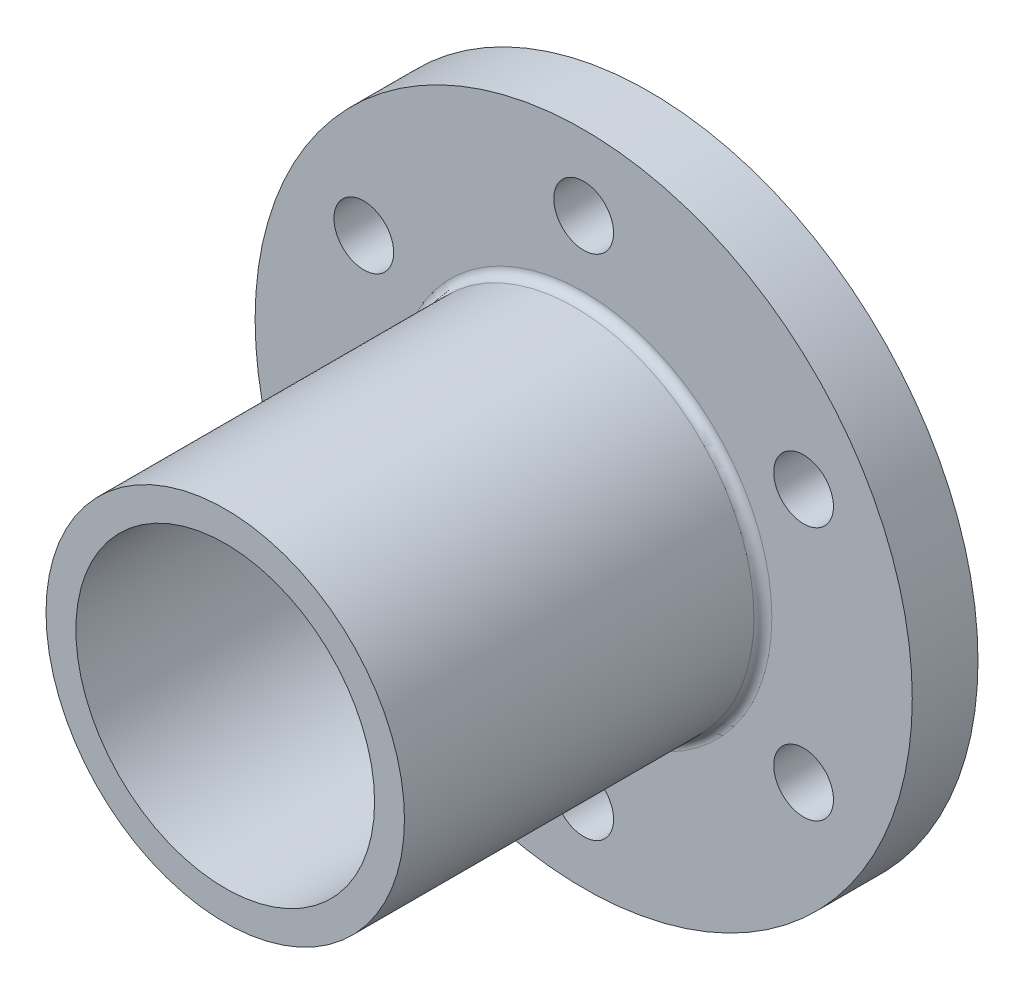
ISO-10303-21;
HEADER;
FILE_DESCRIPTION(('STEP AP214'),'2;1');
FILE_NAME('part.step','',(''),(''),'','','');
FILE_SCHEMA(('AUTOMOTIVE_DESIGN { 1 0 10303 214 1 1 1 1 }'));
ENDSEC;
DATA;
#1=APPLICATION_CONTEXT('core data for automotive mechanical design processes');
#2=APPLICATION_PROTOCOL_DEFINITION('international standard','automotive_design',2000,#1);
#3=PRODUCT_CONTEXT('',#1,'mechanical');
#4=PRODUCT('Part','Part','',(#3));
#5=PRODUCT_RELATED_PRODUCT_CATEGORY('part','',(#4));
#6=PRODUCT_DEFINITION_FORMATION('','',#4);
#7=PRODUCT_DEFINITION_CONTEXT('part definition',#1,'design');
#8=PRODUCT_DEFINITION('design','',#6,#7);
#9=PRODUCT_DEFINITION_SHAPE('','',#8);
#10=(LENGTH_UNIT() NAMED_UNIT(*) SI_UNIT(.MILLI.,.METRE.));
#11=(NAMED_UNIT(*) PLANE_ANGLE_UNIT() SI_UNIT($,.RADIAN.));
#12=(NAMED_UNIT(*) SI_UNIT($,.STERADIAN.) SOLID_ANGLE_UNIT());
#13=UNCERTAINTY_MEASURE_WITH_UNIT(LENGTH_MEASURE(1.E-05),#10,'distance_accuracy_value','');
#14=(GEOMETRIC_REPRESENTATION_CONTEXT(3) GLOBAL_UNCERTAINTY_ASSIGNED_CONTEXT((#13)) GLOBAL_UNIT_ASSIGNED_CONTEXT((#10,
#11,#12)) REPRESENTATION_CONTEXT('',''));
#15=CARTESIAN_POINT('',(0.,0.,0.));
#16=DIRECTION('',(0.,0.,1.));
#17=DIRECTION('',(1.,0.,0.));
#18=AXIS2_PLACEMENT_3D('',#15,#16,#17);
#19=CARTESIAN_POINT('',(0.,0.,22.));
#20=DIRECTION('',(0.,0.,-1.));
#21=DIRECTION('',(-1.,0.,0.));
#22=AXIS2_PLACEMENT_3D('',#19,#20,#21);
#23=CYLINDRICAL_SURFACE('',#22,110.);
#24=CARTESIAN_POINT('',(0.,0.,22.));
#25=DIRECTION('',(0.,0.,1.));
#26=DIRECTION('',(1.,0.,0.));
#27=AXIS2_PLACEMENT_3D('',#24,#25,#26);
#28=CIRCLE('',#27,110.);
#29=CARTESIAN_POINT('',(110.,0.,22.));
#30=VERTEX_POINT('',#29);
#31=EDGE_CURVE('E59',#30,#30,#28,.T.);
#32=ORIENTED_EDGE('',*,*,#31,.F.);
#33=EDGE_LOOP('',(#32));
#34=FACE_BOUND('',#33,.T.);
#35=CARTESIAN_POINT('',(0.,0.,0.));
#36=DIRECTION('',(0.,0.,1.));
#37=DIRECTION('',(1.,0.,0.));
#38=AXIS2_PLACEMENT_3D('',#35,#36,#37);
#39=CIRCLE('',#38,110.);
#40=CARTESIAN_POINT('',(110.,0.,0.));
#41=VERTEX_POINT('',#40);
#42=EDGE_CURVE('E64',#41,#41,#39,.T.);
#43=ORIENTED_EDGE('',*,*,#42,.T.);
#44=EDGE_LOOP('',(#43));
#45=FACE_BOUND('',#44,.T.);
#46=ADVANCED_FACE('F44',(#34,#45),#23,.T.);
#47=CARTESIAN_POINT('',(0.,0.,22.));
#48=DIRECTION('',(0.,0.,1.));
#49=DIRECTION('',(1.,0.,0.));
#50=AXIS2_PLACEMENT_3D('',#47,#48,#49);
#51=PLANE('',#50);
#52=CARTESIAN_POINT('',(0.,0.,22.));
#53=DIRECTION('',(0.,0.,1.));
#54=DIRECTION('',(1.,0.,0.));
#55=AXIS2_PLACEMENT_3D('',#52,#53,#54);
#56=CIRCLE('',#55,63.);
#57=CARTESIAN_POINT('',(63.,0.,22.));
#58=VERTEX_POINT('',#57);
#59=EDGE_CURVE('E10',#58,#58,#56,.F.);
#60=ORIENTED_EDGE('',*,*,#59,.T.);
#61=EDGE_LOOP('',(#60));
#62=FACE_BOUND('',#61,.T.);
#63=CARTESIAN_POINT('',(0.,85.,22.));
#64=DIRECTION('',(0.,0.,1.));
#65=DIRECTION('',(1.,0.,0.));
#66=AXIS2_PLACEMENT_3D('',#63,#64,#65);
#67=CIRCLE('',#66,10.);
#68=CARTESIAN_POINT('',(10.,85.,22.));
#69=VERTEX_POINT('',#68);
#70=EDGE_CURVE('E113',#69,#69,#67,.T.);
#71=ORIENTED_EDGE('',*,*,#70,.F.);
#72=EDGE_LOOP('',(#71));
#73=FACE_BOUND('',#72,.T.);
#74=CARTESIAN_POINT('',(-73.6121593216768,42.5000000000009,22.));
#75=DIRECTION('',(0.,0.,1.));
#76=DIRECTION('',(1.,0.,0.));
#77=AXIS2_PLACEMENT_3D('',#74,#75,#76);
#78=CIRCLE('',#77,10.);
#79=CARTESIAN_POINT('',(-63.6121593216768,42.5000000000009,22.));
#80=VERTEX_POINT('',#79);
#81=EDGE_CURVE('E87',#80,#80,#78,.T.);
#82=ORIENTED_EDGE('',*,*,#81,.F.);
#83=EDGE_LOOP('',(#82));
#84=FACE_BOUND('',#83,.T.);
#85=CARTESIAN_POINT('',(-73.6121593216777,-42.4999999999993,22.));
#86=DIRECTION('',(0.,0.,1.));
#87=DIRECTION('',(1.,0.,0.));
#88=AXIS2_PLACEMENT_3D('',#85,#86,#87);
#89=CIRCLE('',#88,10.);
#90=CARTESIAN_POINT('',(-63.6121593216777,-42.4999999999993,22.));
#91=VERTEX_POINT('',#90);
#92=EDGE_CURVE('E88',#91,#91,#89,.T.);
#93=ORIENTED_EDGE('',*,*,#92,.F.);
#94=EDGE_LOOP('',(#93));
#95=FACE_BOUND('',#94,.T.);
#96=CARTESIAN_POINT('',(-5.93551827603333E-13,-85.,22.));
#97=DIRECTION('',(0.,0.,1.));
#98=DIRECTION('',(1.,0.,0.));
#99=AXIS2_PLACEMENT_3D('',#96,#97,#98);
#100=CIRCLE('',#99,10.);
#101=CARTESIAN_POINT('',(9.99999999999941,-85.,22.));
#102=VERTEX_POINT('',#101);
#103=EDGE_CURVE('E92',#102,#102,#100,.T.);
#104=ORIENTED_EDGE('',*,*,#103,.F.);
#105=EDGE_LOOP('',(#104));
#106=FACE_BOUND('',#105,.T.);
#107=CARTESIAN_POINT('',(73.6121593216771,-42.5000000000003,22.));
#108=DIRECTION('',(0.,0.,1.));
#109=DIRECTION('',(1.,0.,0.));
#110=AXIS2_PLACEMENT_3D('',#107,#108,#109);
#111=CIRCLE('',#110,10.);
#112=CARTESIAN_POINT('',(83.6121593216771,-42.5000000000003,22.));
#113=VERTEX_POINT('',#112);
#114=EDGE_CURVE('E103',#113,#113,#111,.T.);
#115=ORIENTED_EDGE('',*,*,#114,.F.);
#116=EDGE_LOOP('',(#115));
#117=FACE_BOUND('',#116,.T.);
#118=CARTESIAN_POINT('',(73.6121593216774,42.4999999999998,22.));
#119=DIRECTION('',(0.,0.,1.));
#120=DIRECTION('',(1.,0.,0.));
#121=AXIS2_PLACEMENT_3D('',#118,#119,#120);
#122=CIRCLE('',#121,9.99999999999999);
#123=CARTESIAN_POINT('',(83.6121593216774,42.4999999999998,22.));
#124=VERTEX_POINT('',#123);
#125=EDGE_CURVE('E112',#124,#124,#122,.T.);
#126=ORIENTED_EDGE('',*,*,#125,.F.);
#127=EDGE_LOOP('',(#126));
#128=FACE_BOUND('',#127,.T.);
#129=ORIENTED_EDGE('',*,*,#31,.T.);
#130=EDGE_LOOP('',(#129));
#131=FACE_BOUND('',#130,.T.);
#132=ADVANCED_FACE('F136',(#62,#73,#84,#95,#106,#117,#128,#131),#51,.T.);
#133=CARTESIAN_POINT('',(0.,0.,0.));
#134=DIRECTION('',(0.,0.,1.));
#135=DIRECTION('',(1.,0.,0.));
#136=AXIS2_PLACEMENT_3D('',#133,#134,#135);
#137=PLANE('',#136);
#138=CARTESIAN_POINT('',(0.,85.,0.));
#139=DIRECTION('',(0.,0.,1.));
#140=DIRECTION('',(1.,0.,0.));
#141=AXIS2_PLACEMENT_3D('',#138,#139,#140);
#142=CIRCLE('',#141,10.);
#143=CARTESIAN_POINT('',(10.,85.,0.));
#144=VERTEX_POINT('',#143);
#145=EDGE_CURVE('E79',#144,#144,#142,.T.);
#146=ORIENTED_EDGE('',*,*,#145,.T.);
#147=EDGE_LOOP('',(#146));
#148=FACE_BOUND('',#147,.T.);
#149=CARTESIAN_POINT('',(-73.6121593216768,42.5000000000009,0.));
#150=DIRECTION('',(0.,0.,1.));
#151=DIRECTION('',(1.,0.,0.));
#152=AXIS2_PLACEMENT_3D('',#149,#150,#151);
#153=CIRCLE('',#152,10.);
#154=CARTESIAN_POINT('',(-63.6121593216768,42.5000000000009,0.));
#155=VERTEX_POINT('',#154);
#156=EDGE_CURVE('E117',#155,#155,#153,.T.);
#157=ORIENTED_EDGE('',*,*,#156,.T.);
#158=EDGE_LOOP('',(#157));
#159=FACE_BOUND('',#158,.T.);
#160=CARTESIAN_POINT('',(-73.6121593216777,-42.4999999999993,0.));
#161=DIRECTION('',(0.,0.,1.));
#162=DIRECTION('',(1.,0.,0.));
#163=AXIS2_PLACEMENT_3D('',#160,#161,#162);
#164=CIRCLE('',#163,10.);
#165=CARTESIAN_POINT('',(-63.6121593216777,-42.4999999999993,0.));
#166=VERTEX_POINT('',#165);
#167=EDGE_CURVE('E85',#166,#166,#164,.T.);
#168=ORIENTED_EDGE('',*,*,#167,.T.);
#169=EDGE_LOOP('',(#168));
#170=FACE_BOUND('',#169,.T.);
#171=CARTESIAN_POINT('',(-5.93551827603333E-13,-85.,0.));
#172=DIRECTION('',(0.,0.,1.));
#173=DIRECTION('',(1.,0.,0.));
#174=AXIS2_PLACEMENT_3D('',#171,#172,#173);
#175=CIRCLE('',#174,10.);
#176=CARTESIAN_POINT('',(9.99999999999941,-85.,0.));
#177=VERTEX_POINT('',#176);
#178=EDGE_CURVE('E93',#177,#177,#175,.T.);
#179=ORIENTED_EDGE('',*,*,#178,.T.);
#180=EDGE_LOOP('',(#179));
#181=FACE_BOUND('',#180,.T.);
#182=CARTESIAN_POINT('',(73.6121593216771,-42.5000000000003,0.));
#183=DIRECTION('',(0.,0.,1.));
#184=DIRECTION('',(1.,0.,0.));
#185=AXIS2_PLACEMENT_3D('',#182,#183,#184);
#186=CIRCLE('',#185,10.);
#187=CARTESIAN_POINT('',(83.6121593216771,-42.5000000000003,0.));
#188=VERTEX_POINT('',#187);
#189=EDGE_CURVE('E97',#188,#188,#186,.T.);
#190=ORIENTED_EDGE('',*,*,#189,.T.);
#191=EDGE_LOOP('',(#190));
#192=FACE_BOUND('',#191,.T.);
#193=CARTESIAN_POINT('',(73.6121593216774,42.4999999999998,0.));
#194=DIRECTION('',(0.,0.,1.));
#195=DIRECTION('',(1.,0.,0.));
#196=AXIS2_PLACEMENT_3D('',#193,#194,#195);
#197=CIRCLE('',#196,9.99999999999999);
#198=CARTESIAN_POINT('',(83.6121593216774,42.4999999999998,0.));
#199=VERTEX_POINT('',#198);
#200=EDGE_CURVE('E110',#199,#199,#197,.T.);
#201=ORIENTED_EDGE('',*,*,#200,.T.);
#202=EDGE_LOOP('',(#201));
#203=FACE_BOUND('',#202,.T.);
#204=CARTESIAN_POINT('',(0.,0.,0.));
#205=DIRECTION('',(0.,0.,1.));
#206=DIRECTION('',(1.,0.,0.));
#207=AXIS2_PLACEMENT_3D('',#204,#205,#206);
#208=CIRCLE('',#207,50.);
#209=CARTESIAN_POINT('',(50.,0.,0.));
#210=VERTEX_POINT('',#209);
#211=EDGE_CURVE('E71',#210,#210,#208,.T.);
#212=ORIENTED_EDGE('',*,*,#211,.T.);
#213=EDGE_LOOP('',(#212));
#214=FACE_BOUND('',#213,.T.);
#215=ORIENTED_EDGE('',*,*,#42,.F.);
#216=EDGE_LOOP('',(#215));
#217=FACE_BOUND('',#216,.T.);
#218=ADVANCED_FACE('F128',(#148,#159,#170,#181,#192,#203,#214,#217),#137,.F.);
#219=CARTESIAN_POINT('',(0.,0.,142.));
#220=DIRECTION('',(0.,0.,-1.));
#221=DIRECTION('',(-1.,0.,0.));
#222=AXIS2_PLACEMENT_3D('',#219,#220,#221);
#223=CYLINDRICAL_SURFACE('',#222,60.);
#224=CARTESIAN_POINT('',(0.,0.,25.));
#225=DIRECTION('',(0.,0.,1.));
#226=DIRECTION('',(1.,0.,0.));
#227=AXIS2_PLACEMENT_3D('',#224,#225,#226);
#228=CIRCLE('',#227,60.);
#229=CARTESIAN_POINT('',(60.,0.,25.));
#230=VERTEX_POINT('',#229);
#231=EDGE_CURVE('E52',#230,#230,#228,.T.);
#232=ORIENTED_EDGE('',*,*,#231,.T.);
#233=EDGE_LOOP('',(#232));
#234=FACE_BOUND('',#233,.T.);
#235=CARTESIAN_POINT('',(0.,0.,142.));
#236=DIRECTION('',(0.,0.,1.));
#237=DIRECTION('',(1.,0.,0.));
#238=AXIS2_PLACEMENT_3D('',#235,#236,#237);
#239=CIRCLE('',#238,60.);
#240=CARTESIAN_POINT('',(60.,0.,142.));
#241=VERTEX_POINT('',#240);
#242=EDGE_CURVE('E68',#241,#241,#239,.T.);
#243=ORIENTED_EDGE('',*,*,#242,.F.);
#244=EDGE_LOOP('',(#243));
#245=FACE_BOUND('',#244,.T.);
#246=ADVANCED_FACE('F161',(#234,#245),#223,.T.);
#247=CARTESIAN_POINT('',(0.,0.,142.));
#248=DIRECTION('',(0.,0.,1.));
#249=DIRECTION('',(1.,0.,0.));
#250=AXIS2_PLACEMENT_3D('',#247,#248,#249);
#251=PLANE('',#250);
#252=CARTESIAN_POINT('',(0.,0.,142.));
#253=DIRECTION('',(0.,0.,1.));
#254=DIRECTION('',(1.,0.,0.));
#255=AXIS2_PLACEMENT_3D('',#252,#253,#254);
#256=CIRCLE('',#255,50.);
#257=CARTESIAN_POINT('',(50.,0.,142.));
#258=VERTEX_POINT('',#257);
#259=EDGE_CURVE('E74',#258,#258,#256,.T.);
#260=ORIENTED_EDGE('',*,*,#259,.F.);
#261=EDGE_LOOP('',(#260));
#262=FACE_BOUND('',#261,.T.);
#263=ORIENTED_EDGE('',*,*,#242,.T.);
#264=EDGE_LOOP('',(#263));
#265=FACE_BOUND('',#264,.T.);
#266=ADVANCED_FACE('F169',(#262,#265),#251,.T.);
#267=CARTESIAN_POINT('',(0.,0.,0.));
#268=DIRECTION('',(0.,0.,1.));
#269=DIRECTION('',(1.,0.,0.));
#270=AXIS2_PLACEMENT_3D('',#267,#268,#269);
#271=CYLINDRICAL_SURFACE('',#270,50.);
#272=ORIENTED_EDGE('',*,*,#211,.F.);
#273=EDGE_LOOP('',(#272));
#274=FACE_BOUND('',#273,.T.);
#275=ORIENTED_EDGE('',*,*,#259,.T.);
#276=EDGE_LOOP('',(#275));
#277=FACE_BOUND('',#276,.T.);
#278=ADVANCED_FACE('F174',(#274,#277),#271,.F.);
#279=CARTESIAN_POINT('',(73.6121593216774,42.4999999999998,0.));
#280=DIRECTION('',(0.,0.,1.));
#281=DIRECTION('',(1.,0.,0.));
#282=AXIS2_PLACEMENT_3D('',#279,#280,#281);
#283=CYLINDRICAL_SURFACE('',#282,9.99999999999999);
#284=ORIENTED_EDGE('',*,*,#200,.F.);
#285=EDGE_LOOP('',(#284));
#286=FACE_BOUND('',#285,.T.);
#287=ORIENTED_EDGE('',*,*,#125,.T.);
#288=EDGE_LOOP('',(#287));
#289=FACE_BOUND('',#288,.T.);
#290=ADVANCED_FACE('F177',(#286,#289),#283,.F.);
#291=CARTESIAN_POINT('',(73.6121593216771,-42.5000000000003,0.));
#292=DIRECTION('',(0.,0.,1.));
#293=DIRECTION('',(1.,0.,0.));
#294=AXIS2_PLACEMENT_3D('',#291,#292,#293);
#295=CYLINDRICAL_SURFACE('',#294,10.);
#296=ORIENTED_EDGE('',*,*,#189,.F.);
#297=EDGE_LOOP('',(#296));
#298=FACE_BOUND('',#297,.T.);
#299=ORIENTED_EDGE('',*,*,#114,.T.);
#300=EDGE_LOOP('',(#299));
#301=FACE_BOUND('',#300,.T.);
#302=ADVANCED_FACE('F183',(#298,#301),#295,.F.);
#303=CARTESIAN_POINT('',(-5.93551827603333E-13,-85.,0.));
#304=DIRECTION('',(0.,0.,1.));
#305=DIRECTION('',(1.,0.,0.));
#306=AXIS2_PLACEMENT_3D('',#303,#304,#305);
#307=CYLINDRICAL_SURFACE('',#306,10.);
#308=ORIENTED_EDGE('',*,*,#178,.F.);
#309=EDGE_LOOP('',(#308));
#310=FACE_BOUND('',#309,.T.);
#311=ORIENTED_EDGE('',*,*,#103,.T.);
#312=EDGE_LOOP('',(#311));
#313=FACE_BOUND('',#312,.T.);
#314=ADVANCED_FACE('F182',(#310,#313),#307,.F.);
#315=CARTESIAN_POINT('',(-73.6121593216777,-42.4999999999993,0.));
#316=DIRECTION('',(0.,0.,1.));
#317=DIRECTION('',(1.,0.,0.));
#318=AXIS2_PLACEMENT_3D('',#315,#316,#317);
#319=CYLINDRICAL_SURFACE('',#318,10.);
#320=ORIENTED_EDGE('',*,*,#167,.F.);
#321=EDGE_LOOP('',(#320));
#322=FACE_BOUND('',#321,.T.);
#323=ORIENTED_EDGE('',*,*,#92,.T.);
#324=EDGE_LOOP('',(#323));
#325=FACE_BOUND('',#324,.T.);
#326=ADVANCED_FACE('F178',(#322,#325),#319,.F.);
#327=CARTESIAN_POINT('',(-73.6121593216768,42.5000000000009,0.));
#328=DIRECTION('',(0.,0.,1.));
#329=DIRECTION('',(1.,0.,0.));
#330=AXIS2_PLACEMENT_3D('',#327,#328,#329);
#331=CYLINDRICAL_SURFACE('',#330,10.);
#332=ORIENTED_EDGE('',*,*,#156,.F.);
#333=EDGE_LOOP('',(#332));
#334=FACE_BOUND('',#333,.T.);
#335=ORIENTED_EDGE('',*,*,#81,.T.);
#336=EDGE_LOOP('',(#335));
#337=FACE_BOUND('',#336,.T.);
#338=ADVANCED_FACE('F137',(#334,#337),#331,.F.);
#339=CARTESIAN_POINT('',(0.,85.,0.));
#340=DIRECTION('',(0.,0.,1.));
#341=DIRECTION('',(1.,0.,0.));
#342=AXIS2_PLACEMENT_3D('',#339,#340,#341);
#343=CYLINDRICAL_SURFACE('',#342,10.);
#344=ORIENTED_EDGE('',*,*,#145,.F.);
#345=EDGE_LOOP('',(#344));
#346=FACE_BOUND('',#345,.T.);
#347=ORIENTED_EDGE('',*,*,#70,.T.);
#348=EDGE_LOOP('',(#347));
#349=FACE_BOUND('',#348,.T.);
#350=ADVANCED_FACE('F134',(#346,#349),#343,.F.);
#351=CARTESIAN_POINT('',(0.,0.,25.));
#352=DIRECTION('',(0.,0.,1.));
#353=DIRECTION('',(1.,0.,0.));
#354=AXIS2_PLACEMENT_3D('',#351,#352,#353);
#355=TOROIDAL_SURFACE('',#354,63.,3.);
#356=ORIENTED_EDGE('',*,*,#59,.F.);
#357=EDGE_LOOP('',(#356));
#358=FACE_BOUND('',#357,.T.);
#359=ORIENTED_EDGE('',*,*,#231,.F.);
#360=EDGE_LOOP('',(#359));
#361=FACE_BOUND('',#360,.T.);
#362=ADVANCED_FACE('F50',(#358,#361),#355,.F.);
#363=CLOSED_SHELL('',(#46,#132,#218,#246,#266,#278,#290,#302,#314,#326,#338,#350,#362));
#364=MANIFOLD_SOLID_BREP('B2',#363);
#365=ADVANCED_BREP_SHAPE_REPRESENTATION('',(#18,#364),#14);
#366=SHAPE_DEFINITION_REPRESENTATION(#9,#365);
ENDSEC;
END-ISO-10303-21;
